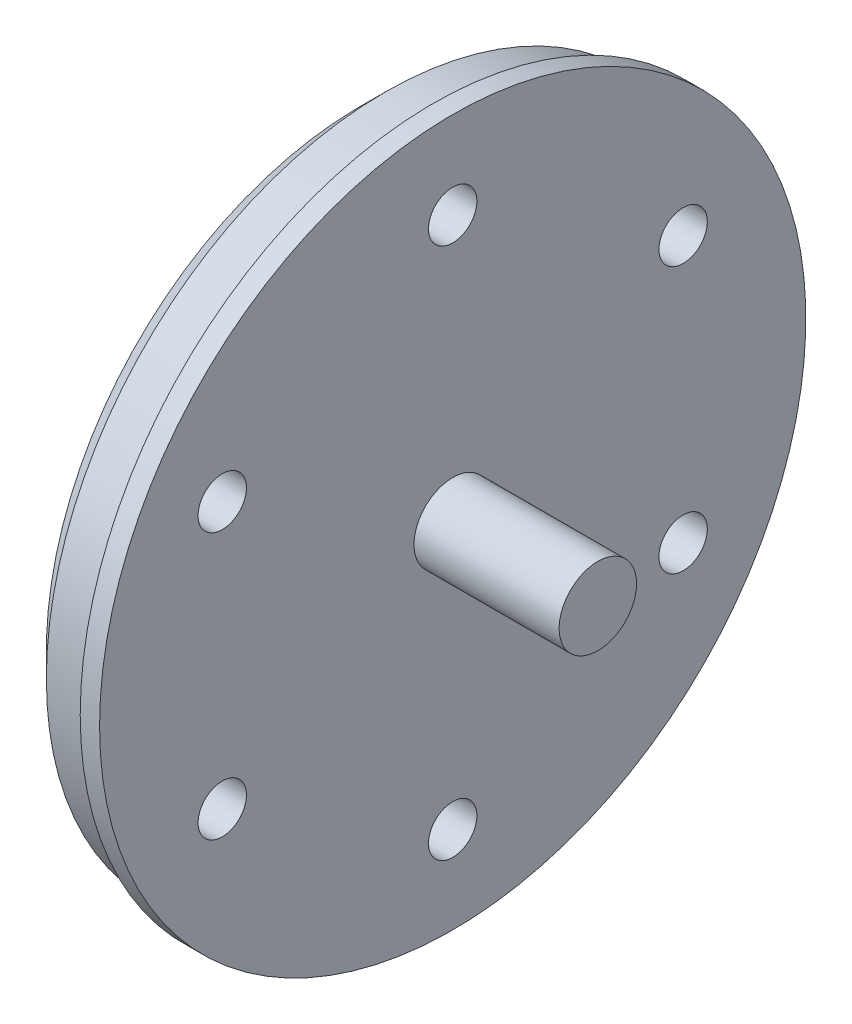
ISO-10303-21;
HEADER;
FILE_DESCRIPTION(('STEP AP214'),'2;1');
FILE_NAME('part.step','',(''),(''),'','','');
FILE_SCHEMA(('AUTOMOTIVE_DESIGN { 1 0 10303 214 1 1 1 1 }'));
ENDSEC;
DATA;
#1=APPLICATION_CONTEXT('core data for automotive mechanical design processes');
#2=APPLICATION_PROTOCOL_DEFINITION('international standard','automotive_design',2000,#1);
#3=PRODUCT_CONTEXT('',#1,'mechanical');
#4=PRODUCT('Part','Part','',(#3));
#5=PRODUCT_RELATED_PRODUCT_CATEGORY('part','',(#4));
#6=PRODUCT_DEFINITION_FORMATION('','',#4);
#7=PRODUCT_DEFINITION_CONTEXT('part definition',#1,'design');
#8=PRODUCT_DEFINITION('design','',#6,#7);
#9=PRODUCT_DEFINITION_SHAPE('','',#8);
#10=(LENGTH_UNIT() NAMED_UNIT(*) SI_UNIT(.MILLI.,.METRE.));
#11=(NAMED_UNIT(*) PLANE_ANGLE_UNIT() SI_UNIT($,.RADIAN.));
#12=(NAMED_UNIT(*) SI_UNIT($,.STERADIAN.) SOLID_ANGLE_UNIT());
#13=UNCERTAINTY_MEASURE_WITH_UNIT(LENGTH_MEASURE(1.E-05),#10,'distance_accuracy_value','');
#14=(GEOMETRIC_REPRESENTATION_CONTEXT(3) GLOBAL_UNCERTAINTY_ASSIGNED_CONTEXT((#13)) GLOBAL_UNIT_ASSIGNED_CONTEXT((#10,
#11,#12)) REPRESENTATION_CONTEXT('',''));
#15=CARTESIAN_POINT('',(0.,0.,0.));
#16=DIRECTION('',(0.,0.,1.));
#17=DIRECTION('',(1.,0.,0.));
#18=AXIS2_PLACEMENT_3D('',#15,#16,#17);
#19=CARTESIAN_POINT('',(9.5,0.,0.));
#20=DIRECTION('',(1.,0.,0.));
#21=DIRECTION('',(0.,0.,-1.));
#22=AXIS2_PLACEMENT_3D('',#19,#20,#21);
#23=PLANE('',#22);
#24=CARTESIAN_POINT('',(9.5,27.5,0.));
#25=DIRECTION('',(1.,0.,0.));
#26=DIRECTION('',(0.,0.,-1.));
#27=AXIS2_PLACEMENT_3D('',#24,#25,#26);
#28=CIRCLE('',#27,2.5);
#29=CARTESIAN_POINT('',(9.5,27.5,-2.5));
#30=VERTEX_POINT('',#29);
#31=EDGE_CURVE('E97',#30,#30,#28,.T.);
#32=ORIENTED_EDGE('',*,*,#31,.F.);
#33=EDGE_LOOP('',(#32));
#34=FACE_BOUND('',#33,.T.);
#35=CARTESIAN_POINT('',(9.5,13.75,-23.8156986040721));
#36=DIRECTION('',(1.,0.,0.));
#37=DIRECTION('',(0.,0.,-1.));
#38=AXIS2_PLACEMENT_3D('',#35,#36,#37);
#39=CIRCLE('',#38,2.5);
#40=CARTESIAN_POINT('',(9.5,13.75,-26.3156986040721));
#41=VERTEX_POINT('',#40);
#42=EDGE_CURVE('E104',#41,#41,#39,.T.);
#43=ORIENTED_EDGE('',*,*,#42,.F.);
#44=EDGE_LOOP('',(#43));
#45=FACE_BOUND('',#44,.T.);
#46=CARTESIAN_POINT('',(9.5,-13.75,-23.8156986040721));
#47=DIRECTION('',(1.,0.,0.));
#48=DIRECTION('',(0.,0.,-1.));
#49=AXIS2_PLACEMENT_3D('',#46,#47,#48);
#50=CIRCLE('',#49,2.5);
#51=CARTESIAN_POINT('',(9.5,-13.75,-26.3156986040721));
#52=VERTEX_POINT('',#51);
#53=EDGE_CURVE('E108',#52,#52,#50,.T.);
#54=ORIENTED_EDGE('',*,*,#53,.F.);
#55=EDGE_LOOP('',(#54));
#56=FACE_BOUND('',#55,.T.);
#57=CARTESIAN_POINT('',(9.5,-27.5,0.));
#58=DIRECTION('',(1.,0.,0.));
#59=DIRECTION('',(0.,0.,-1.));
#60=AXIS2_PLACEMENT_3D('',#57,#58,#59);
#61=CIRCLE('',#60,2.5);
#62=CARTESIAN_POINT('',(9.5,-27.5,-2.5));
#63=VERTEX_POINT('',#62);
#64=EDGE_CURVE('E112',#63,#63,#61,.T.);
#65=ORIENTED_EDGE('',*,*,#64,.F.);
#66=EDGE_LOOP('',(#65));
#67=FACE_BOUND('',#66,.T.);
#68=CARTESIAN_POINT('',(9.5,-13.75,23.8156986040721));
#69=DIRECTION('',(1.,0.,0.));
#70=DIRECTION('',(0.,0.,-1.));
#71=AXIS2_PLACEMENT_3D('',#68,#69,#70);
#72=CIRCLE('',#71,2.5);
#73=CARTESIAN_POINT('',(9.5,-13.75,21.3156986040721));
#74=VERTEX_POINT('',#73);
#75=EDGE_CURVE('E116',#74,#74,#72,.T.);
#76=ORIENTED_EDGE('',*,*,#75,.F.);
#77=EDGE_LOOP('',(#76));
#78=FACE_BOUND('',#77,.T.);
#79=CARTESIAN_POINT('',(9.5,13.75,23.8156986040721));
#80=DIRECTION('',(1.,0.,0.));
#81=DIRECTION('',(0.,0.,-1.));
#82=AXIS2_PLACEMENT_3D('',#79,#80,#81);
#83=CIRCLE('',#82,2.5);
#84=CARTESIAN_POINT('',(9.5,13.75,21.3156986040721));
#85=VERTEX_POINT('',#84);
#86=EDGE_CURVE('E120',#85,#85,#83,.T.);
#87=ORIENTED_EDGE('',*,*,#86,.F.);
#88=EDGE_LOOP('',(#87));
#89=FACE_BOUND('',#88,.T.);
#90=CARTESIAN_POINT('',(9.5,0.,0.));
#91=DIRECTION('',(1.,0.,0.));
#92=DIRECTION('',(0.,0.,-1.));
#93=AXIS2_PLACEMENT_3D('',#90,#91,#92);
#94=CIRCLE('',#93,4.);
#95=CARTESIAN_POINT('',(9.5,0.,-4.));
#96=VERTEX_POINT('',#95);
#97=EDGE_CURVE('E85',#96,#96,#94,.T.);
#98=ORIENTED_EDGE('',*,*,#97,.F.);
#99=EDGE_LOOP('',(#98));
#100=FACE_BOUND('',#99,.T.);
#101=CARTESIAN_POINT('',(9.5,0.,0.));
#102=DIRECTION('',(-1.,0.,0.));
#103=DIRECTION('',(0.,0.,1.));
#104=AXIS2_PLACEMENT_3D('',#101,#102,#103);
#105=CIRCLE('',#104,36.5);
#106=CARTESIAN_POINT('',(9.5,0.,36.5));
#107=VERTEX_POINT('',#106);
#108=EDGE_CURVE('E93',#107,#107,#105,.T.);
#109=ORIENTED_EDGE('',*,*,#108,.F.);
#110=EDGE_LOOP('',(#109));
#111=FACE_BOUND('',#110,.T.);
#112=ADVANCED_FACE('F47',(#34,#45,#56,#67,#78,#89,#100,#111),#23,.T.);
#113=CARTESIAN_POINT('',(24.5,0.,0.));
#114=DIRECTION('',(-1.,0.,0.));
#115=DIRECTION('',(0.,0.,1.));
#116=AXIS2_PLACEMENT_3D('',#113,#114,#115);
#117=CYLINDRICAL_SURFACE('',#116,4.);
#118=CARTESIAN_POINT('',(24.5,0.,0.));
#119=DIRECTION('',(1.,0.,0.));
#120=DIRECTION('',(0.,0.,-1.));
#121=AXIS2_PLACEMENT_3D('',#118,#119,#120);
#122=CIRCLE('',#121,4.);
#123=CARTESIAN_POINT('',(24.5,0.,-4.));
#124=VERTEX_POINT('',#123);
#125=EDGE_CURVE('E80',#124,#124,#122,.T.);
#126=ORIENTED_EDGE('',*,*,#125,.F.);
#127=EDGE_LOOP('',(#126));
#128=FACE_BOUND('',#127,.T.);
#129=ORIENTED_EDGE('',*,*,#97,.T.);
#130=EDGE_LOOP('',(#129));
#131=FACE_BOUND('',#130,.T.);
#132=ADVANCED_FACE('F183',(#128,#131),#117,.T.);
#133=CARTESIAN_POINT('',(24.5,0.,0.));
#134=DIRECTION('',(1.,0.,0.));
#135=DIRECTION('',(0.,0.,-1.));
#136=AXIS2_PLACEMENT_3D('',#133,#134,#135);
#137=PLANE('',#136);
#138=ORIENTED_EDGE('',*,*,#125,.T.);
#139=EDGE_LOOP('',(#138));
#140=FACE_BOUND('',#139,.T.);
#141=ADVANCED_FACE('F190',(#140),#137,.T.);
#142=CARTESIAN_POINT('',(7.5,0.,0.));
#143=DIRECTION('',(1.,0.,0.));
#144=DIRECTION('',(0.,0.,-1.));
#145=AXIS2_PLACEMENT_3D('',#142,#143,#144);
#146=CYLINDRICAL_SURFACE('',#145,36.5);
#147=CARTESIAN_POINT('',(7.5,0.,0.));
#148=DIRECTION('',(-1.,0.,0.));
#149=DIRECTION('',(0.,0.,1.));
#150=AXIS2_PLACEMENT_3D('',#147,#148,#149);
#151=CIRCLE('',#150,36.5);
#152=CARTESIAN_POINT('',(7.5,0.,36.5));
#153=VERTEX_POINT('',#152);
#154=EDGE_CURVE('E86',#153,#153,#151,.T.);
#155=ORIENTED_EDGE('',*,*,#154,.F.);
#156=EDGE_LOOP('',(#155));
#157=FACE_BOUND('',#156,.T.);
#158=ORIENTED_EDGE('',*,*,#108,.T.);
#159=EDGE_LOOP('',(#158));
#160=FACE_BOUND('',#159,.T.);
#161=ADVANCED_FACE('F220',(#157,#160),#146,.T.);
#162=CARTESIAN_POINT('',(7.5,0.,0.));
#163=DIRECTION('',(-1.,0.,0.));
#164=DIRECTION('',(0.,0.,1.));
#165=AXIS2_PLACEMENT_3D('',#162,#163,#164);
#166=PLANE('',#165);
#167=CARTESIAN_POINT('',(7.5,0.,0.));
#168=DIRECTION('',(-1.,0.,0.));
#169=DIRECTION('',(0.,0.,1.));
#170=AXIS2_PLACEMENT_3D('',#167,#168,#169);
#171=CIRCLE('',#170,35.);
#172=CARTESIAN_POINT('',(7.5,0.,35.));
#173=VERTEX_POINT('',#172);
#174=EDGE_CURVE('E81',#173,#173,#171,.T.);
#175=ORIENTED_EDGE('',*,*,#174,.F.);
#176=EDGE_LOOP('',(#175));
#177=FACE_BOUND('',#176,.T.);
#178=ORIENTED_EDGE('',*,*,#154,.T.);
#179=EDGE_LOOP('',(#178));
#180=FACE_BOUND('',#179,.T.);
#181=ADVANCED_FACE('F155',(#177,#180),#166,.T.);
#182=CARTESIAN_POINT('',(0.,0.,0.));
#183=DIRECTION('',(1.,0.,0.));
#184=DIRECTION('',(0.,0.,-1.));
#185=AXIS2_PLACEMENT_3D('',#182,#183,#184);
#186=PLANE('',#185);
#187=CARTESIAN_POINT('',(0.,0.,0.));
#188=DIRECTION('',(1.,0.,0.));
#189=DIRECTION('',(0.,0.,-1.));
#190=AXIS2_PLACEMENT_3D('',#187,#188,#189);
#191=CIRCLE('',#190,32.5);
#192=CARTESIAN_POINT('',(0.,0.,-32.5));
#193=VERTEX_POINT('',#192);
#194=EDGE_CURVE('E11',#193,#193,#191,.F.);
#195=ORIENTED_EDGE('',*,*,#194,.T.);
#196=EDGE_LOOP('',(#195));
#197=FACE_BOUND('',#196,.T.);
#198=CARTESIAN_POINT('',(0.,0.,0.));
#199=DIRECTION('',(1.,0.,0.));
#200=DIRECTION('',(0.,0.,-1.));
#201=AXIS2_PLACEMENT_3D('',#198,#199,#200);
#202=CIRCLE('',#201,22.5);
#203=CARTESIAN_POINT('',(0.,0.,-22.5));
#204=VERTEX_POINT('',#203);
#205=EDGE_CURVE('E56',#204,#204,#202,.T.);
#206=ORIENTED_EDGE('',*,*,#205,.T.);
#207=EDGE_LOOP('',(#206));
#208=FACE_BOUND('',#207,.T.);
#209=CARTESIAN_POINT('',(0.,27.5,0.));
#210=DIRECTION('',(-1.,0.,0.));
#211=DIRECTION('',(0.,0.,1.));
#212=AXIS2_PLACEMENT_3D('',#209,#210,#211);
#213=CIRCLE('',#212,2.5);
#214=CARTESIAN_POINT('',(0.,27.5,2.5));
#215=VERTEX_POINT('',#214);
#216=EDGE_CURVE('E124',#215,#215,#213,.T.);
#217=ORIENTED_EDGE('',*,*,#216,.F.);
#218=EDGE_LOOP('',(#217));
#219=FACE_BOUND('',#218,.T.);
#220=CARTESIAN_POINT('',(0.,13.75,-23.8156986040721));
#221=DIRECTION('',(-1.,0.,0.));
#222=DIRECTION('',(0.,0.,1.));
#223=AXIS2_PLACEMENT_3D('',#220,#221,#222);
#224=CIRCLE('',#223,2.5);
#225=CARTESIAN_POINT('',(0.,13.75,-21.3156986040721));
#226=VERTEX_POINT('',#225);
#227=EDGE_CURVE('E130',#226,#226,#224,.T.);
#228=ORIENTED_EDGE('',*,*,#227,.F.);
#229=EDGE_LOOP('',(#228));
#230=FACE_BOUND('',#229,.T.);
#231=CARTESIAN_POINT('',(0.,-13.75,-23.8156986040721));
#232=DIRECTION('',(-1.,0.,0.));
#233=DIRECTION('',(0.,0.,1.));
#234=AXIS2_PLACEMENT_3D('',#231,#232,#233);
#235=CIRCLE('',#234,2.5);
#236=CARTESIAN_POINT('',(0.,-13.75,-21.3156986040721));
#237=VERTEX_POINT('',#236);
#238=EDGE_CURVE('E125',#237,#237,#235,.T.);
#239=ORIENTED_EDGE('',*,*,#238,.F.);
#240=EDGE_LOOP('',(#239));
#241=FACE_BOUND('',#240,.T.);
#242=CARTESIAN_POINT('',(0.,-27.5,0.));
#243=DIRECTION('',(-1.,0.,0.));
#244=DIRECTION('',(0.,0.,1.));
#245=AXIS2_PLACEMENT_3D('',#242,#243,#244);
#246=CIRCLE('',#245,2.5);
#247=CARTESIAN_POINT('',(0.,-27.5,2.50000000000001));
#248=VERTEX_POINT('',#247);
#249=EDGE_CURVE('E129',#248,#248,#246,.T.);
#250=ORIENTED_EDGE('',*,*,#249,.F.);
#251=EDGE_LOOP('',(#250));
#252=FACE_BOUND('',#251,.T.);
#253=CARTESIAN_POINT('',(0.,-13.75,23.8156986040721));
#254=DIRECTION('',(-1.,0.,0.));
#255=DIRECTION('',(0.,0.,1.));
#256=AXIS2_PLACEMENT_3D('',#253,#254,#255);
#257=CIRCLE('',#256,2.5);
#258=CARTESIAN_POINT('',(0.,-13.75,26.3156986040721));
#259=VERTEX_POINT('',#258);
#260=EDGE_CURVE('E134',#259,#259,#257,.T.);
#261=ORIENTED_EDGE('',*,*,#260,.F.);
#262=EDGE_LOOP('',(#261));
#263=FACE_BOUND('',#262,.T.);
#264=CARTESIAN_POINT('',(0.,13.75,23.8156986040721));
#265=DIRECTION('',(-1.,0.,0.));
#266=DIRECTION('',(0.,0.,1.));
#267=AXIS2_PLACEMENT_3D('',#264,#265,#266);
#268=CIRCLE('',#267,2.5);
#269=CARTESIAN_POINT('',(0.,13.75,26.3156986040721));
#270=VERTEX_POINT('',#269);
#271=EDGE_CURVE('E138',#270,#270,#268,.T.);
#272=ORIENTED_EDGE('',*,*,#271,.F.);
#273=EDGE_LOOP('',(#272));
#274=FACE_BOUND('',#273,.T.);
#275=ADVANCED_FACE('F151',(#197,#208,#219,#230,#241,#252,#263,#274),#186,.F.);
#276=CARTESIAN_POINT('',(9.5,0.,0.));
#277=DIRECTION('',(-1.,0.,0.));
#278=DIRECTION('',(0.,0.,1.));
#279=AXIS2_PLACEMENT_3D('',#276,#277,#278);
#280=CYLINDRICAL_SURFACE('',#279,35.);
#281=CARTESIAN_POINT('',(2.5,0.,0.));
#282=DIRECTION('',(1.,0.,0.));
#283=DIRECTION('',(0.,0.,-1.));
#284=AXIS2_PLACEMENT_3D('',#281,#282,#283);
#285=CIRCLE('',#284,35.);
#286=CARTESIAN_POINT('',(2.5,0.,-35.));
#287=VERTEX_POINT('',#286);
#288=EDGE_CURVE('E61',#287,#287,#285,.T.);
#289=ORIENTED_EDGE('',*,*,#288,.T.);
#290=EDGE_LOOP('',(#289));
#291=FACE_BOUND('',#290,.T.);
#292=ORIENTED_EDGE('',*,*,#174,.T.);
#293=EDGE_LOOP('',(#292));
#294=FACE_BOUND('',#293,.T.);
#295=ADVANCED_FACE('F154',(#291,#294),#280,.T.);
#296=CARTESIAN_POINT('',(34.5710678118655,13.75,23.8156986040721));
#297=DIRECTION('',(-1.,0.,0.));
#298=DIRECTION('',(0.,0.,1.));
#299=AXIS2_PLACEMENT_3D('',#296,#297,#298);
#300=CYLINDRICAL_SURFACE('',#299,2.5);
#301=ORIENTED_EDGE('',*,*,#86,.T.);
#302=EDGE_LOOP('',(#301));
#303=FACE_BOUND('',#302,.T.);
#304=ORIENTED_EDGE('',*,*,#271,.T.);
#305=EDGE_LOOP('',(#304));
#306=FACE_BOUND('',#305,.T.);
#307=ADVANCED_FACE('F167',(#303,#306),#300,.F.);
#308=CARTESIAN_POINT('',(34.5710678118655,-13.75,23.8156986040721));
#309=DIRECTION('',(-1.,0.,0.));
#310=DIRECTION('',(0.,0.,1.));
#311=AXIS2_PLACEMENT_3D('',#308,#309,#310);
#312=CYLINDRICAL_SURFACE('',#311,2.5);
#313=ORIENTED_EDGE('',*,*,#75,.T.);
#314=EDGE_LOOP('',(#313));
#315=FACE_BOUND('',#314,.T.);
#316=ORIENTED_EDGE('',*,*,#260,.T.);
#317=EDGE_LOOP('',(#316));
#318=FACE_BOUND('',#317,.T.);
#319=ADVANCED_FACE('F169',(#315,#318),#312,.F.);
#320=CARTESIAN_POINT('',(34.5710678118655,-27.5,0.));
#321=DIRECTION('',(-1.,0.,0.));
#322=DIRECTION('',(0.,0.,1.));
#323=AXIS2_PLACEMENT_3D('',#320,#321,#322);
#324=CYLINDRICAL_SURFACE('',#323,2.5);
#325=ORIENTED_EDGE('',*,*,#64,.T.);
#326=EDGE_LOOP('',(#325));
#327=FACE_BOUND('',#326,.T.);
#328=ORIENTED_EDGE('',*,*,#249,.T.);
#329=EDGE_LOOP('',(#328));
#330=FACE_BOUND('',#329,.T.);
#331=ADVANCED_FACE('F176',(#327,#330),#324,.F.);
#332=CARTESIAN_POINT('',(34.5710678118655,-13.75,-23.8156986040721));
#333=DIRECTION('',(-1.,0.,0.));
#334=DIRECTION('',(0.,0.,1.));
#335=AXIS2_PLACEMENT_3D('',#332,#333,#334);
#336=CYLINDRICAL_SURFACE('',#335,2.5);
#337=ORIENTED_EDGE('',*,*,#53,.T.);
#338=EDGE_LOOP('',(#337));
#339=FACE_BOUND('',#338,.T.);
#340=ORIENTED_EDGE('',*,*,#238,.T.);
#341=EDGE_LOOP('',(#340));
#342=FACE_BOUND('',#341,.T.);
#343=ADVANCED_FACE('F234',(#339,#342),#336,.F.);
#344=CARTESIAN_POINT('',(34.5710678118655,13.75,-23.8156986040721));
#345=DIRECTION('',(-1.,0.,0.));
#346=DIRECTION('',(0.,0.,1.));
#347=AXIS2_PLACEMENT_3D('',#344,#345,#346);
#348=CYLINDRICAL_SURFACE('',#347,2.5);
#349=ORIENTED_EDGE('',*,*,#42,.T.);
#350=EDGE_LOOP('',(#349));
#351=FACE_BOUND('',#350,.T.);
#352=ORIENTED_EDGE('',*,*,#227,.T.);
#353=EDGE_LOOP('',(#352));
#354=FACE_BOUND('',#353,.T.);
#355=ADVANCED_FACE('F237',(#351,#354),#348,.F.);
#356=CARTESIAN_POINT('',(34.5710678118655,27.5,0.));
#357=DIRECTION('',(-1.,0.,0.));
#358=DIRECTION('',(0.,0.,1.));
#359=AXIS2_PLACEMENT_3D('',#356,#357,#358);
#360=CYLINDRICAL_SURFACE('',#359,2.5);
#361=ORIENTED_EDGE('',*,*,#31,.T.);
#362=EDGE_LOOP('',(#361));
#363=FACE_BOUND('',#362,.T.);
#364=ORIENTED_EDGE('',*,*,#216,.T.);
#365=EDGE_LOOP('',(#364));
#366=FACE_BOUND('',#365,.T.);
#367=ADVANCED_FACE('F149',(#363,#366),#360,.F.);
#368=CARTESIAN_POINT('',(64.0685424949238,0.,0.));
#369=DIRECTION('',(-1.,0.,0.));
#370=DIRECTION('',(0.,0.,1.));
#371=AXIS2_PLACEMENT_3D('',#368,#369,#370);
#372=CYLINDRICAL_SURFACE('',#371,20.);
#373=CARTESIAN_POINT('',(4.99999999999996,0.,0.));
#374=DIRECTION('',(-1.,0.,0.));
#375=DIRECTION('',(0.,0.,1.));
#376=AXIS2_PLACEMENT_3D('',#373,#374,#375);
#377=CIRCLE('',#376,20.);
#378=CARTESIAN_POINT('',(4.99999999999996,0.,20.));
#379=VERTEX_POINT('',#378);
#380=EDGE_CURVE('E72',#379,#379,#377,.F.);
#381=ORIENTED_EDGE('',*,*,#380,.T.);
#382=EDGE_LOOP('',(#381));
#383=FACE_BOUND('',#382,.T.);
#384=CARTESIAN_POINT('',(2.5,0.,0.));
#385=DIRECTION('',(1.,0.,0.));
#386=DIRECTION('',(0.,0.,-1.));
#387=AXIS2_PLACEMENT_3D('',#384,#385,#386);
#388=CIRCLE('',#387,20.);
#389=CARTESIAN_POINT('',(2.5,0.,-20.));
#390=VERTEX_POINT('',#389);
#391=EDGE_CURVE('E76',#390,#390,#388,.F.);
#392=ORIENTED_EDGE('',*,*,#391,.T.);
#393=EDGE_LOOP('',(#392));
#394=FACE_BOUND('',#393,.T.);
#395=ADVANCED_FACE('F274',(#383,#394),#372,.F.);
#396=CARTESIAN_POINT('',(7.5,0.,0.));
#397=DIRECTION('',(-1.,0.,0.));
#398=DIRECTION('',(0.,0.,1.));
#399=AXIS2_PLACEMENT_3D('',#396,#397,#398);
#400=PLANE('',#399);
#401=CARTESIAN_POINT('',(7.5,0.,0.));
#402=DIRECTION('',(-1.,0.,0.));
#403=DIRECTION('',(0.,0.,1.));
#404=AXIS2_PLACEMENT_3D('',#401,#402,#403);
#405=CIRCLE('',#404,17.5);
#406=CARTESIAN_POINT('',(7.5,0.,17.5));
#407=VERTEX_POINT('',#406);
#408=EDGE_CURVE('E66',#407,#407,#405,.T.);
#409=ORIENTED_EDGE('',*,*,#408,.T.);
#410=EDGE_LOOP('',(#409));
#411=FACE_BOUND('',#410,.T.);
#412=ADVANCED_FACE('F204',(#411),#400,.T.);
#413=CARTESIAN_POINT('',(4.99999999999996,0.,0.));
#414=DIRECTION('',(-1.,0.,0.));
#415=DIRECTION('',(0.,0.,1.));
#416=AXIS2_PLACEMENT_3D('',#413,#414,#415);
#417=CONICAL_SURFACE('',#416,20.,0.785398163397442);
#418=ORIENTED_EDGE('',*,*,#408,.F.);
#419=EDGE_LOOP('',(#418));
#420=FACE_BOUND('',#419,.T.);
#421=ORIENTED_EDGE('',*,*,#380,.F.);
#422=EDGE_LOOP('',(#421));
#423=FACE_BOUND('',#422,.T.);
#424=ADVANCED_FACE('F198',(#420,#423),#417,.F.);
#425=CARTESIAN_POINT('',(2.5,0.,0.));
#426=DIRECTION('',(1.,0.,0.));
#427=DIRECTION('',(0.,0.,-1.));
#428=AXIS2_PLACEMENT_3D('',#425,#426,#427);
#429=CONICAL_SURFACE('',#428,35.,0.78539816339745);
#430=ORIENTED_EDGE('',*,*,#194,.F.);
#431=EDGE_LOOP('',(#430));
#432=FACE_BOUND('',#431,.T.);
#433=ORIENTED_EDGE('',*,*,#288,.F.);
#434=EDGE_LOOP('',(#433));
#435=FACE_BOUND('',#434,.T.);
#436=ADVANCED_FACE('F203',(#432,#435),#429,.T.);
#437=CARTESIAN_POINT('',(2.5,0.,0.));
#438=DIRECTION('',(-1.,0.,0.));
#439=DIRECTION('',(0.,0.,1.));
#440=AXIS2_PLACEMENT_3D('',#437,#438,#439);
#441=CONICAL_SURFACE('',#440,20.,0.785398163397449);
#442=ORIENTED_EDGE('',*,*,#205,.F.);
#443=EDGE_LOOP('',(#442));
#444=FACE_BOUND('',#443,.T.);
#445=ORIENTED_EDGE('',*,*,#391,.F.);
#446=EDGE_LOOP('',(#445));
#447=FACE_BOUND('',#446,.T.);
#448=ADVANCED_FACE('F50',(#444,#447),#441,.F.);
#449=CLOSED_SHELL('',(#112,#132,#141,#161,#181,#275,#295,#307,#319,#331,#343,#355,#367,#395,
#412,#424,#436,#448));
#450=MANIFOLD_SOLID_BREP('B2',#449);
#451=ADVANCED_BREP_SHAPE_REPRESENTATION('',(#18,#450),#14);
#452=SHAPE_DEFINITION_REPRESENTATION(#9,#451);
ENDSEC;
END-ISO-10303-21;
